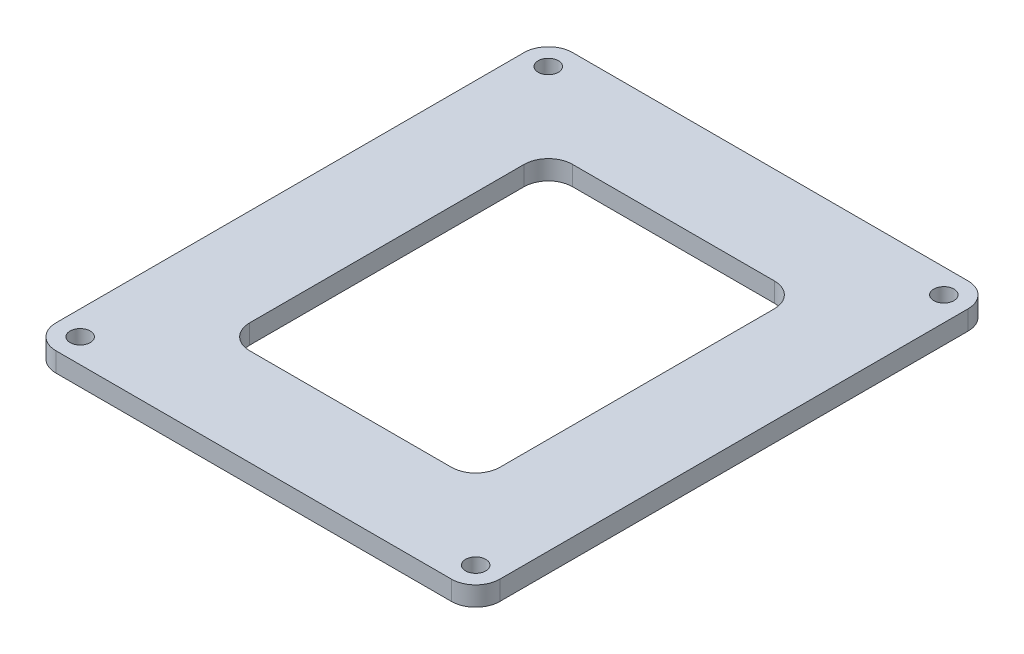
ISO-10303-21;
HEADER;
FILE_DESCRIPTION(('STEP AP214'),'2;1');
FILE_NAME('part.step','',(''),(''),'','','');
FILE_SCHEMA(('AUTOMOTIVE_DESIGN { 1 0 10303 214 1 1 1 1 }'));
ENDSEC;
DATA;
#1=APPLICATION_CONTEXT('core data for automotive mechanical design processes');
#2=APPLICATION_PROTOCOL_DEFINITION('international standard','automotive_design',2000,#1);
#3=PRODUCT_CONTEXT('',#1,'mechanical');
#4=PRODUCT('Part','Part','',(#3));
#5=PRODUCT_RELATED_PRODUCT_CATEGORY('part','',(#4));
#6=PRODUCT_DEFINITION_FORMATION('','',#4);
#7=PRODUCT_DEFINITION_CONTEXT('part definition',#1,'design');
#8=PRODUCT_DEFINITION('design','',#6,#7);
#9=PRODUCT_DEFINITION_SHAPE('','',#8);
#10=(LENGTH_UNIT() NAMED_UNIT(*) SI_UNIT(.MILLI.,.METRE.));
#11=(NAMED_UNIT(*) PLANE_ANGLE_UNIT() SI_UNIT($,.RADIAN.));
#12=(NAMED_UNIT(*) SI_UNIT($,.STERADIAN.) SOLID_ANGLE_UNIT());
#13=UNCERTAINTY_MEASURE_WITH_UNIT(LENGTH_MEASURE(1.E-05),#10,'distance_accuracy_value','');
#14=(GEOMETRIC_REPRESENTATION_CONTEXT(3) GLOBAL_UNCERTAINTY_ASSIGNED_CONTEXT((#13)) GLOBAL_UNIT_ASSIGNED_CONTEXT((#10,
#11,#12)) REPRESENTATION_CONTEXT('',''));
#15=CARTESIAN_POINT('',(0.,0.,0.));
#16=DIRECTION('',(0.,0.,1.));
#17=DIRECTION('',(1.,0.,0.));
#18=AXIS2_PLACEMENT_3D('',#15,#16,#17);
#19=CARTESIAN_POINT('',(0.,2.4,0.));
#20=DIRECTION('',(0.,-1.,0.));
#21=DIRECTION('',(0.,0.,-1.));
#22=AXIS2_PLACEMENT_3D('',#19,#20,#21);
#23=PLANE('',#22);
#24=CARTESIAN_POINT('',(-24.5,2.4,29.));
#25=DIRECTION('',(0.,1.,0.));
#26=DIRECTION('',(0.,0.,-1.));
#27=AXIS2_PLACEMENT_3D('',#24,#25,#26);
#28=CIRCLE('',#27,1.25);
#29=CARTESIAN_POINT('',(-24.5,2.4,27.75));
#30=VERTEX_POINT('',#29);
#31=EDGE_CURVE('E266',#30,#30,#28,.T.);
#32=ORIENTED_EDGE('',*,*,#31,.F.);
#33=EDGE_LOOP('',(#32));
#34=FACE_BOUND('',#33,.T.);
#35=CARTESIAN_POINT('',(24.5,2.4,29.));
#36=DIRECTION('',(0.,1.,0.));
#37=DIRECTION('',(0.,0.,1.));
#38=AXIS2_PLACEMENT_3D('',#35,#36,#37);
#39=CIRCLE('',#38,1.25);
#40=CARTESIAN_POINT('',(24.5,2.4,30.25));
#41=VERTEX_POINT('',#40);
#42=EDGE_CURVE('E274',#41,#41,#39,.T.);
#43=ORIENTED_EDGE('',*,*,#42,.F.);
#44=EDGE_LOOP('',(#43));
#45=FACE_BOUND('',#44,.T.);
#46=CARTESIAN_POINT('',(24.5,2.4,-29.));
#47=DIRECTION('',(0.,1.,0.));
#48=DIRECTION('',(0.,0.,-1.));
#49=AXIS2_PLACEMENT_3D('',#46,#47,#48);
#50=CIRCLE('',#49,1.25);
#51=CARTESIAN_POINT('',(24.5,2.4,-30.25));
#52=VERTEX_POINT('',#51);
#53=EDGE_CURVE('E280',#52,#52,#50,.T.);
#54=ORIENTED_EDGE('',*,*,#53,.F.);
#55=EDGE_LOOP('',(#54));
#56=FACE_BOUND('',#55,.T.);
#57=CARTESIAN_POINT('',(-24.5,2.4,-29.));
#58=DIRECTION('',(0.,1.,0.));
#59=DIRECTION('',(0.,0.,1.));
#60=AXIS2_PLACEMENT_3D('',#57,#58,#59);
#61=CIRCLE('',#60,1.25);
#62=CARTESIAN_POINT('',(-24.5,2.4,-27.75));
#63=VERTEX_POINT('',#62);
#64=EDGE_CURVE('E286',#63,#63,#61,.T.);
#65=ORIENTED_EDGE('',*,*,#64,.F.);
#66=EDGE_LOOP('',(#65));
#67=FACE_BOUND('',#66,.T.);
#68=DIRECTION('',(-1.,0.,0.));
#69=VECTOR('',#68,1.);
#70=CARTESIAN_POINT('',(-27.5,2.4,-32.));
#71=LINE('',#70,#69);
#72=CARTESIAN_POINT('',(24.5,2.4,-32.));
#73=VERTEX_POINT('',#72);
#74=CARTESIAN_POINT('',(-24.5,2.4,-32.));
#75=VERTEX_POINT('',#74);
#76=EDGE_CURVE('E295',#73,#75,#71,.T.);
#77=ORIENTED_EDGE('',*,*,#76,.T.);
#78=CARTESIAN_POINT('',(-24.5,2.4,-29.));
#79=DIRECTION('',(0.,-1.,0.));
#80=DIRECTION('',(0.,0.,-1.));
#81=AXIS2_PLACEMENT_3D('',#78,#79,#80);
#82=CIRCLE('',#81,3.);
#83=CARTESIAN_POINT('',(-27.5,2.4,-29.));
#84=VERTEX_POINT('',#83);
#85=EDGE_CURVE('E217',#75,#84,#82,.F.);
#86=ORIENTED_EDGE('',*,*,#85,.T.);
#87=DIRECTION('',(0.,0.,1.));
#88=VECTOR('',#87,1.);
#89=CARTESIAN_POINT('',(-27.5,2.4,32.));
#90=LINE('',#89,#88);
#91=CARTESIAN_POINT('',(-27.5,2.4,29.));
#92=VERTEX_POINT('',#91);
#93=EDGE_CURVE('E175',#84,#92,#90,.T.);
#94=ORIENTED_EDGE('',*,*,#93,.T.);
#95=CARTESIAN_POINT('',(-24.5,2.4,29.));
#96=DIRECTION('',(0.,-1.,0.));
#97=DIRECTION('',(0.,0.,-1.));
#98=AXIS2_PLACEMENT_3D('',#95,#96,#97);
#99=CIRCLE('',#98,3.);
#100=CARTESIAN_POINT('',(-24.5,2.4,32.));
#101=VERTEX_POINT('',#100);
#102=EDGE_CURVE('E57',#92,#101,#99,.F.);
#103=ORIENTED_EDGE('',*,*,#102,.T.);
#104=DIRECTION('',(1.,0.,0.));
#105=VECTOR('',#104,1.);
#106=CARTESIAN_POINT('',(-27.5,2.4,32.));
#107=LINE('',#106,#105);
#108=CARTESIAN_POINT('',(24.5,2.4,32.));
#109=VERTEX_POINT('',#108);
#110=EDGE_CURVE('E171',#101,#109,#107,.T.);
#111=ORIENTED_EDGE('',*,*,#110,.T.);
#112=CARTESIAN_POINT('',(24.5,2.4,29.));
#113=DIRECTION('',(0.,-1.,0.));
#114=DIRECTION('',(0.,0.,-1.));
#115=AXIS2_PLACEMENT_3D('',#112,#113,#114);
#116=CIRCLE('',#115,3.);
#117=CARTESIAN_POINT('',(27.5,2.4,29.));
#118=VERTEX_POINT('',#117);
#119=EDGE_CURVE('E213',#109,#118,#116,.F.);
#120=ORIENTED_EDGE('',*,*,#119,.T.);
#121=DIRECTION('',(0.,0.,-1.));
#122=VECTOR('',#121,1.);
#123=CARTESIAN_POINT('',(27.5,2.4,32.));
#124=LINE('',#123,#122);
#125=CARTESIAN_POINT('',(27.5,2.4,-29.));
#126=VERTEX_POINT('',#125);
#127=EDGE_CURVE('E292',#118,#126,#124,.T.);
#128=ORIENTED_EDGE('',*,*,#127,.T.);
#129=CARTESIAN_POINT('',(24.5,2.4,-29.));
#130=DIRECTION('',(0.,-1.,0.));
#131=DIRECTION('',(0.,0.,-1.));
#132=AXIS2_PLACEMENT_3D('',#129,#130,#131);
#133=CIRCLE('',#132,3.);
#134=EDGE_CURVE('E215',#126,#73,#133,.F.);
#135=ORIENTED_EDGE('',*,*,#134,.T.);
#136=EDGE_LOOP('',(#77,#86,#94,#103,#111,#120,#128,#135));
#137=FACE_BOUND('',#136,.T.);
#138=DIRECTION('',(1.,0.,0.));
#139=VECTOR('',#138,1.);
#140=CARTESIAN_POINT('',(-15.5,2.4,20.));
#141=LINE('',#140,#139);
#142=CARTESIAN_POINT('',(-12.5,2.4,20.));
#143=VERTEX_POINT('',#142);
#144=CARTESIAN_POINT('',(12.5,2.4,20.));
#145=VERTEX_POINT('',#144);
#146=EDGE_CURVE('E167',#143,#145,#141,.T.);
#147=ORIENTED_EDGE('',*,*,#146,.F.);
#148=CARTESIAN_POINT('',(-12.5,2.4,17.));
#149=DIRECTION('',(0.,-1.,0.));
#150=DIRECTION('',(0.,0.,-1.));
#151=AXIS2_PLACEMENT_3D('',#148,#149,#150);
#152=CIRCLE('',#151,3.);
#153=CARTESIAN_POINT('',(-15.5,2.4,17.));
#154=VERTEX_POINT('',#153);
#155=EDGE_CURVE('E230',#143,#154,#152,.T.);
#156=ORIENTED_EDGE('',*,*,#155,.T.);
#157=DIRECTION('',(0.,0.,1.));
#158=VECTOR('',#157,1.);
#159=CARTESIAN_POINT('',(-15.5,2.4,20.));
#160=LINE('',#159,#158);
#161=CARTESIAN_POINT('',(-15.5,2.4,-17.));
#162=VERTEX_POINT('',#161);
#163=EDGE_CURVE('E273',#162,#154,#160,.T.);
#164=ORIENTED_EDGE('',*,*,#163,.F.);
#165=CARTESIAN_POINT('',(-12.5,2.4,-17.));
#166=DIRECTION('',(0.,-1.,0.));
#167=DIRECTION('',(0.,0.,-1.));
#168=AXIS2_PLACEMENT_3D('',#165,#166,#167);
#169=CIRCLE('',#168,3.);
#170=CARTESIAN_POINT('',(-12.5,2.4,-20.));
#171=VERTEX_POINT('',#170);
#172=EDGE_CURVE('E11',#162,#171,#169,.T.);
#173=ORIENTED_EDGE('',*,*,#172,.T.);
#174=DIRECTION('',(-1.,0.,0.));
#175=VECTOR('',#174,1.);
#176=CARTESIAN_POINT('',(-15.5,2.4,-20.));
#177=LINE('',#176,#175);
#178=CARTESIAN_POINT('',(12.5,2.4,-20.));
#179=VERTEX_POINT('',#178);
#180=EDGE_CURVE('E247',#179,#171,#177,.T.);
#181=ORIENTED_EDGE('',*,*,#180,.F.);
#182=CARTESIAN_POINT('',(12.5,2.4,-17.));
#183=DIRECTION('',(0.,-1.,0.));
#184=DIRECTION('',(0.,0.,-1.));
#185=AXIS2_PLACEMENT_3D('',#182,#183,#184);
#186=CIRCLE('',#185,3.);
#187=CARTESIAN_POINT('',(15.5,2.4,-17.));
#188=VERTEX_POINT('',#187);
#189=EDGE_CURVE('E158',#179,#188,#186,.T.);
#190=ORIENTED_EDGE('',*,*,#189,.T.);
#191=DIRECTION('',(0.,0.,-1.));
#192=VECTOR('',#191,1.);
#193=CARTESIAN_POINT('',(15.5,2.4,20.));
#194=LINE('',#193,#192);
#195=CARTESIAN_POINT('',(15.5,2.4,17.));
#196=VERTEX_POINT('',#195);
#197=EDGE_CURVE('E244',#196,#188,#194,.T.);
#198=ORIENTED_EDGE('',*,*,#197,.F.);
#199=CARTESIAN_POINT('',(12.5,2.4,17.));
#200=DIRECTION('',(0.,-1.,0.));
#201=DIRECTION('',(0.,0.,-1.));
#202=AXIS2_PLACEMENT_3D('',#199,#200,#201);
#203=CIRCLE('',#202,3.);
#204=EDGE_CURVE('E234',#196,#145,#203,.T.);
#205=ORIENTED_EDGE('',*,*,#204,.T.);
#206=EDGE_LOOP('',(#147,#156,#164,#173,#181,#190,#198,#205));
#207=FACE_BOUND('',#206,.T.);
#208=ADVANCED_FACE('F35',(#34,#45,#56,#67,#137,#207),#23,.F.);
#209=CARTESIAN_POINT('',(0.,0.,0.));
#210=DIRECTION('',(0.,-1.,0.));
#211=DIRECTION('',(0.,0.,-1.));
#212=AXIS2_PLACEMENT_3D('',#209,#210,#211);
#213=PLANE('',#212);
#214=CARTESIAN_POINT('',(24.5,0.,29.));
#215=DIRECTION('',(0.,1.,0.));
#216=DIRECTION('',(0.,0.,1.));
#217=AXIS2_PLACEMENT_3D('',#214,#215,#216);
#218=CIRCLE('',#217,1.25);
#219=CARTESIAN_POINT('',(24.5,0.,30.25));
#220=VERTEX_POINT('',#219);
#221=EDGE_CURVE('E269',#220,#220,#218,.T.);
#222=ORIENTED_EDGE('',*,*,#221,.T.);
#223=EDGE_LOOP('',(#222));
#224=FACE_BOUND('',#223,.T.);
#225=CARTESIAN_POINT('',(-24.5,0.,-29.));
#226=DIRECTION('',(0.,1.,0.));
#227=DIRECTION('',(0.,0.,1.));
#228=AXIS2_PLACEMENT_3D('',#225,#226,#227);
#229=CIRCLE('',#228,1.25);
#230=CARTESIAN_POINT('',(-24.5,0.,-27.75));
#231=VERTEX_POINT('',#230);
#232=EDGE_CURVE('E283',#231,#231,#229,.T.);
#233=ORIENTED_EDGE('',*,*,#232,.T.);
#234=EDGE_LOOP('',(#233));
#235=FACE_BOUND('',#234,.T.);
#236=DIRECTION('',(0.,0.,1.));
#237=VECTOR('',#236,1.);
#238=CARTESIAN_POINT('',(-27.5,0.,32.));
#239=LINE('',#238,#237);
#240=CARTESIAN_POINT('',(-27.5,0.,-29.));
#241=VERTEX_POINT('',#240);
#242=CARTESIAN_POINT('',(-27.5,0.,29.));
#243=VERTEX_POINT('',#242);
#244=EDGE_CURVE('E303',#241,#243,#239,.T.);
#245=ORIENTED_EDGE('',*,*,#244,.F.);
#246=CARTESIAN_POINT('',(-24.5,0.,-29.));
#247=DIRECTION('',(0.,-1.,0.));
#248=DIRECTION('',(0.,0.,-1.));
#249=AXIS2_PLACEMENT_3D('',#246,#247,#248);
#250=CIRCLE('',#249,3.);
#251=CARTESIAN_POINT('',(-24.5,0.,-32.));
#252=VERTEX_POINT('',#251);
#253=EDGE_CURVE('E205',#241,#252,#250,.T.);
#254=ORIENTED_EDGE('',*,*,#253,.T.);
#255=DIRECTION('',(-1.,0.,0.));
#256=VECTOR('',#255,1.);
#257=CARTESIAN_POINT('',(-27.5,0.,-32.));
#258=LINE('',#257,#256);
#259=CARTESIAN_POINT('',(24.5,0.,-32.));
#260=VERTEX_POINT('',#259);
#261=EDGE_CURVE('E301',#260,#252,#258,.T.);
#262=ORIENTED_EDGE('',*,*,#261,.F.);
#263=CARTESIAN_POINT('',(24.5,0.,-29.));
#264=DIRECTION('',(0.,-1.,0.));
#265=DIRECTION('',(0.,0.,-1.));
#266=AXIS2_PLACEMENT_3D('',#263,#264,#265);
#267=CIRCLE('',#266,3.);
#268=CARTESIAN_POINT('',(27.5,0.,-29.));
#269=VERTEX_POINT('',#268);
#270=EDGE_CURVE('E203',#260,#269,#267,.T.);
#271=ORIENTED_EDGE('',*,*,#270,.T.);
#272=DIRECTION('',(0.,0.,-1.));
#273=VECTOR('',#272,1.);
#274=CARTESIAN_POINT('',(27.5,0.,32.));
#275=LINE('',#274,#273);
#276=CARTESIAN_POINT('',(27.5,0.,29.));
#277=VERTEX_POINT('',#276);
#278=EDGE_CURVE('E289',#277,#269,#275,.T.);
#279=ORIENTED_EDGE('',*,*,#278,.F.);
#280=CARTESIAN_POINT('',(24.5,0.,29.));
#281=DIRECTION('',(0.,-1.,0.));
#282=DIRECTION('',(0.,0.,-1.));
#283=AXIS2_PLACEMENT_3D('',#280,#281,#282);
#284=CIRCLE('',#283,3.);
#285=CARTESIAN_POINT('',(24.5,0.,32.));
#286=VERTEX_POINT('',#285);
#287=EDGE_CURVE('E201',#277,#286,#284,.T.);
#288=ORIENTED_EDGE('',*,*,#287,.T.);
#289=DIRECTION('',(1.,0.,0.));
#290=VECTOR('',#289,1.);
#291=CARTESIAN_POINT('',(-27.5,0.,32.));
#292=LINE('',#291,#290);
#293=CARTESIAN_POINT('',(-24.5,0.,32.));
#294=VERTEX_POINT('',#293);
#295=EDGE_CURVE('E178',#294,#286,#292,.T.);
#296=ORIENTED_EDGE('',*,*,#295,.F.);
#297=CARTESIAN_POINT('',(-24.5,0.,29.));
#298=DIRECTION('',(0.,-1.,0.));
#299=DIRECTION('',(0.,0.,-1.));
#300=AXIS2_PLACEMENT_3D('',#297,#298,#299);
#301=CIRCLE('',#300,3.);
#302=EDGE_CURVE('E199',#294,#243,#301,.T.);
#303=ORIENTED_EDGE('',*,*,#302,.T.);
#304=EDGE_LOOP('',(#245,#254,#262,#271,#279,#288,#296,#303));
#305=FACE_BOUND('',#304,.T.);
#306=CARTESIAN_POINT('',(24.5,0.,-29.));
#307=DIRECTION('',(0.,1.,0.));
#308=DIRECTION('',(0.,0.,-1.));
#309=AXIS2_PLACEMENT_3D('',#306,#307,#308);
#310=CIRCLE('',#309,1.25);
#311=CARTESIAN_POINT('',(24.5,0.,-30.25));
#312=VERTEX_POINT('',#311);
#313=EDGE_CURVE('E277',#312,#312,#310,.T.);
#314=ORIENTED_EDGE('',*,*,#313,.T.);
#315=EDGE_LOOP('',(#314));
#316=FACE_BOUND('',#315,.T.);
#317=CARTESIAN_POINT('',(-24.5,0.,29.));
#318=DIRECTION('',(0.,1.,0.));
#319=DIRECTION('',(0.,0.,-1.));
#320=AXIS2_PLACEMENT_3D('',#317,#318,#319);
#321=CIRCLE('',#320,1.25);
#322=CARTESIAN_POINT('',(-24.5,0.,27.75));
#323=VERTEX_POINT('',#322);
#324=EDGE_CURVE('E270',#323,#323,#321,.T.);
#325=ORIENTED_EDGE('',*,*,#324,.T.);
#326=EDGE_LOOP('',(#325));
#327=FACE_BOUND('',#326,.T.);
#328=DIRECTION('',(-1.,0.,0.));
#329=VECTOR('',#328,1.);
#330=CARTESIAN_POINT('',(-15.5,0.,-20.));
#331=LINE('',#330,#329);
#332=CARTESIAN_POINT('',(12.5,0.,-20.));
#333=VERTEX_POINT('',#332);
#334=CARTESIAN_POINT('',(-12.5,0.,-20.));
#335=VERTEX_POINT('',#334);
#336=EDGE_CURVE('E153',#333,#335,#331,.T.);
#337=ORIENTED_EDGE('',*,*,#336,.T.);
#338=CARTESIAN_POINT('',(-12.5,0.,-17.));
#339=DIRECTION('',(0.,-1.,0.));
#340=DIRECTION('',(0.,0.,-1.));
#341=AXIS2_PLACEMENT_3D('',#338,#339,#340);
#342=CIRCLE('',#341,3.);
#343=CARTESIAN_POINT('',(-15.5,0.,-17.));
#344=VERTEX_POINT('',#343);
#345=EDGE_CURVE('E43',#335,#344,#342,.F.);
#346=ORIENTED_EDGE('',*,*,#345,.T.);
#347=DIRECTION('',(0.,0.,1.));
#348=VECTOR('',#347,1.);
#349=CARTESIAN_POINT('',(-15.5,0.,20.));
#350=LINE('',#349,#348);
#351=CARTESIAN_POINT('',(-15.5,0.,17.));
#352=VERTEX_POINT('',#351);
#353=EDGE_CURVE('E151',#344,#352,#350,.T.);
#354=ORIENTED_EDGE('',*,*,#353,.T.);
#355=CARTESIAN_POINT('',(-12.5,0.,17.));
#356=DIRECTION('',(0.,-1.,0.));
#357=DIRECTION('',(0.,0.,-1.));
#358=AXIS2_PLACEMENT_3D('',#355,#356,#357);
#359=CIRCLE('',#358,3.);
#360=CARTESIAN_POINT('',(-12.5,0.,20.));
#361=VERTEX_POINT('',#360);
#362=EDGE_CURVE('E228',#352,#361,#359,.F.);
#363=ORIENTED_EDGE('',*,*,#362,.T.);
#364=DIRECTION('',(1.,0.,0.));
#365=VECTOR('',#364,1.);
#366=CARTESIAN_POINT('',(-15.5,0.,20.));
#367=LINE('',#366,#365);
#368=CARTESIAN_POINT('',(12.5,0.,20.));
#369=VERTEX_POINT('',#368);
#370=EDGE_CURVE('E262',#361,#369,#367,.T.);
#371=ORIENTED_EDGE('',*,*,#370,.T.);
#372=CARTESIAN_POINT('',(12.5,0.,17.));
#373=DIRECTION('',(0.,-1.,0.));
#374=DIRECTION('',(0.,0.,-1.));
#375=AXIS2_PLACEMENT_3D('',#372,#373,#374);
#376=CIRCLE('',#375,3.);
#377=CARTESIAN_POINT('',(15.5,0.,17.));
#378=VERTEX_POINT('',#377);
#379=EDGE_CURVE('E232',#369,#378,#376,.F.);
#380=ORIENTED_EDGE('',*,*,#379,.T.);
#381=DIRECTION('',(0.,0.,-1.));
#382=VECTOR('',#381,1.);
#383=CARTESIAN_POINT('',(15.5,0.,20.));
#384=LINE('',#383,#382);
#385=CARTESIAN_POINT('',(15.5,0.,-17.));
#386=VERTEX_POINT('',#385);
#387=EDGE_CURVE('E258',#378,#386,#384,.T.);
#388=ORIENTED_EDGE('',*,*,#387,.T.);
#389=CARTESIAN_POINT('',(12.5,0.,-17.));
#390=DIRECTION('',(0.,-1.,0.));
#391=DIRECTION('',(0.,0.,-1.));
#392=AXIS2_PLACEMENT_3D('',#389,#390,#391);
#393=CIRCLE('',#392,3.);
#394=EDGE_CURVE('E236',#386,#333,#393,.F.);
#395=ORIENTED_EDGE('',*,*,#394,.T.);
#396=EDGE_LOOP('',(#337,#346,#354,#363,#371,#380,#388,#395));
#397=FACE_BOUND('',#396,.T.);
#398=ADVANCED_FACE('F150',(#224,#235,#305,#316,#327,#397),#213,.T.);
#399=CARTESIAN_POINT('',(27.5,2.4,32.));
#400=DIRECTION('',(-1.,0.,0.));
#401=DIRECTION('',(0.,0.,1.));
#402=AXIS2_PLACEMENT_3D('',#399,#400,#401);
#403=PLANE('',#402);
#404=ORIENTED_EDGE('',*,*,#278,.T.);
#405=DIRECTION('',(0.,-1.,0.));
#406=VECTOR('',#405,1.);
#407=CARTESIAN_POINT('',(27.5,2.4,-29.));
#408=LINE('',#407,#406);
#409=EDGE_CURVE('E222',#269,#126,#408,.F.);
#410=ORIENTED_EDGE('',*,*,#409,.T.);
#411=ORIENTED_EDGE('',*,*,#127,.F.);
#412=DIRECTION('',(0.,-1.,0.));
#413=VECTOR('',#412,1.);
#414=CARTESIAN_POINT('',(27.5,2.4,29.));
#415=LINE('',#414,#413);
#416=EDGE_CURVE('E219',#118,#277,#415,.T.);
#417=ORIENTED_EDGE('',*,*,#416,.T.);
#418=EDGE_LOOP('',(#404,#410,#411,#417));
#419=FACE_BOUND('',#418,.T.);
#420=ADVANCED_FACE('F319',(#419),#403,.F.);
#421=CARTESIAN_POINT('',(-27.5,2.4,-32.));
#422=DIRECTION('',(0.,0.,1.));
#423=DIRECTION('',(1.,0.,0.));
#424=AXIS2_PLACEMENT_3D('',#421,#422,#423);
#425=PLANE('',#424);
#426=ORIENTED_EDGE('',*,*,#261,.T.);
#427=DIRECTION('',(0.,-1.,0.));
#428=VECTOR('',#427,1.);
#429=CARTESIAN_POINT('',(-24.5,2.4,-32.));
#430=LINE('',#429,#428);
#431=EDGE_CURVE('E210',#252,#75,#430,.F.);
#432=ORIENTED_EDGE('',*,*,#431,.T.);
#433=ORIENTED_EDGE('',*,*,#76,.F.);
#434=DIRECTION('',(0.,-1.,0.));
#435=VECTOR('',#434,1.);
#436=CARTESIAN_POINT('',(24.5,2.4,-32.));
#437=LINE('',#436,#435);
#438=EDGE_CURVE('E207',#73,#260,#437,.T.);
#439=ORIENTED_EDGE('',*,*,#438,.T.);
#440=EDGE_LOOP('',(#426,#432,#433,#439));
#441=FACE_BOUND('',#440,.T.);
#442=ADVANCED_FACE('F328',(#441),#425,.F.);
#443=CARTESIAN_POINT('',(-27.5,2.4,32.));
#444=DIRECTION('',(1.,0.,0.));
#445=DIRECTION('',(0.,0.,-1.));
#446=AXIS2_PLACEMENT_3D('',#443,#444,#445);
#447=PLANE('',#446);
#448=ORIENTED_EDGE('',*,*,#93,.F.);
#449=DIRECTION('',(0.,-1.,0.));
#450=VECTOR('',#449,1.);
#451=CARTESIAN_POINT('',(-27.5,2.4,-29.));
#452=LINE('',#451,#450);
#453=EDGE_CURVE('E196',#84,#241,#452,.T.);
#454=ORIENTED_EDGE('',*,*,#453,.T.);
#455=ORIENTED_EDGE('',*,*,#244,.T.);
#456=DIRECTION('',(0.,-1.,0.));
#457=VECTOR('',#456,1.);
#458=CARTESIAN_POINT('',(-27.5,2.4,29.));
#459=LINE('',#458,#457);
#460=EDGE_CURVE('E194',#243,#92,#459,.F.);
#461=ORIENTED_EDGE('',*,*,#460,.T.);
#462=EDGE_LOOP('',(#448,#454,#455,#461));
#463=FACE_BOUND('',#462,.T.);
#464=ADVANCED_FACE('F335',(#463),#447,.F.);
#465=CARTESIAN_POINT('',(-27.5,2.4,32.));
#466=DIRECTION('',(0.,0.,-1.));
#467=DIRECTION('',(-1.,0.,0.));
#468=AXIS2_PLACEMENT_3D('',#465,#466,#467);
#469=PLANE('',#468);
#470=ORIENTED_EDGE('',*,*,#295,.T.);
#471=DIRECTION('',(0.,-1.,0.));
#472=VECTOR('',#471,1.);
#473=CARTESIAN_POINT('',(24.5,2.4,32.));
#474=LINE('',#473,#472);
#475=EDGE_CURVE('E50',#286,#109,#474,.F.);
#476=ORIENTED_EDGE('',*,*,#475,.T.);
#477=ORIENTED_EDGE('',*,*,#110,.F.);
#478=DIRECTION('',(0.,-1.,0.));
#479=VECTOR('',#478,1.);
#480=CARTESIAN_POINT('',(-24.5,2.4,32.));
#481=LINE('',#480,#479);
#482=EDGE_CURVE('E224',#101,#294,#481,.T.);
#483=ORIENTED_EDGE('',*,*,#482,.T.);
#484=EDGE_LOOP('',(#470,#476,#477,#483));
#485=FACE_BOUND('',#484,.T.);
#486=ADVANCED_FACE('F309',(#485),#469,.F.);
#487=CARTESIAN_POINT('',(-24.5,2.4,-29.));
#488=DIRECTION('',(0.,-1.,0.));
#489=DIRECTION('',(0.,0.,-1.));
#490=AXIS2_PLACEMENT_3D('',#487,#488,#489);
#491=CYLINDRICAL_SURFACE('',#490,1.25);
#492=ORIENTED_EDGE('',*,*,#64,.T.);
#493=EDGE_LOOP('',(#492));
#494=FACE_BOUND('',#493,.T.);
#495=ORIENTED_EDGE('',*,*,#232,.F.);
#496=EDGE_LOOP('',(#495));
#497=FACE_BOUND('',#496,.T.);
#498=ADVANCED_FACE('F368',(#494,#497),#491,.F.);
#499=CARTESIAN_POINT('',(24.5,2.4,-29.));
#500=DIRECTION('',(0.,-1.,0.));
#501=DIRECTION('',(0.,0.,-1.));
#502=AXIS2_PLACEMENT_3D('',#499,#500,#501);
#503=CYLINDRICAL_SURFACE('',#502,1.25);
#504=ORIENTED_EDGE('',*,*,#53,.T.);
#505=EDGE_LOOP('',(#504));
#506=FACE_BOUND('',#505,.T.);
#507=ORIENTED_EDGE('',*,*,#313,.F.);
#508=EDGE_LOOP('',(#507));
#509=FACE_BOUND('',#508,.T.);
#510=ADVANCED_FACE('F357',(#506,#509),#503,.F.);
#511=CARTESIAN_POINT('',(24.5,2.4,29.));
#512=DIRECTION('',(0.,-1.,0.));
#513=DIRECTION('',(0.,0.,-1.));
#514=AXIS2_PLACEMENT_3D('',#511,#512,#513);
#515=CYLINDRICAL_SURFACE('',#514,1.25);
#516=ORIENTED_EDGE('',*,*,#42,.T.);
#517=EDGE_LOOP('',(#516));
#518=FACE_BOUND('',#517,.T.);
#519=ORIENTED_EDGE('',*,*,#221,.F.);
#520=EDGE_LOOP('',(#519));
#521=FACE_BOUND('',#520,.T.);
#522=ADVANCED_FACE('F348',(#518,#521),#515,.F.);
#523=CARTESIAN_POINT('',(-24.5,2.4,29.));
#524=DIRECTION('',(0.,-1.,0.));
#525=DIRECTION('',(0.,0.,-1.));
#526=AXIS2_PLACEMENT_3D('',#523,#524,#525);
#527=CYLINDRICAL_SURFACE('',#526,1.25);
#528=ORIENTED_EDGE('',*,*,#31,.T.);
#529=EDGE_LOOP('',(#528));
#530=FACE_BOUND('',#529,.T.);
#531=ORIENTED_EDGE('',*,*,#324,.F.);
#532=EDGE_LOOP('',(#531));
#533=FACE_BOUND('',#532,.T.);
#534=ADVANCED_FACE('F345',(#530,#533),#527,.F.);
#535=CARTESIAN_POINT('',(-15.5,2.4,20.));
#536=DIRECTION('',(0.,0.,-1.));
#537=DIRECTION('',(-1.,0.,0.));
#538=AXIS2_PLACEMENT_3D('',#535,#536,#537);
#539=PLANE('',#538);
#540=ORIENTED_EDGE('',*,*,#370,.F.);
#541=DIRECTION('',(0.,-1.,0.));
#542=VECTOR('',#541,1.);
#543=CARTESIAN_POINT('',(-12.5,2.4,20.));
#544=LINE('',#543,#542);
#545=EDGE_CURVE('E183',#361,#143,#544,.F.);
#546=ORIENTED_EDGE('',*,*,#545,.T.);
#547=ORIENTED_EDGE('',*,*,#146,.T.);
#548=DIRECTION('',(0.,-1.,0.));
#549=VECTOR('',#548,1.);
#550=CARTESIAN_POINT('',(12.5,0.,20.));
#551=LINE('',#550,#549);
#552=EDGE_CURVE('E173',#145,#369,#551,.T.);
#553=ORIENTED_EDGE('',*,*,#552,.T.);
#554=EDGE_LOOP('',(#540,#546,#547,#553));
#555=FACE_BOUND('',#554,.T.);
#556=ADVANCED_FACE('F347',(#555),#539,.T.);
#557=CARTESIAN_POINT('',(15.5,2.4,20.));
#558=DIRECTION('',(-1.,0.,0.));
#559=DIRECTION('',(0.,0.,1.));
#560=AXIS2_PLACEMENT_3D('',#557,#558,#559);
#561=PLANE('',#560);
#562=ORIENTED_EDGE('',*,*,#387,.F.);
#563=DIRECTION('',(0.,-1.,0.));
#564=VECTOR('',#563,1.);
#565=CARTESIAN_POINT('',(15.5,2.4,17.));
#566=LINE('',#565,#564);
#567=EDGE_CURVE('E188',#378,#196,#566,.F.);
#568=ORIENTED_EDGE('',*,*,#567,.T.);
#569=ORIENTED_EDGE('',*,*,#197,.T.);
#570=DIRECTION('',(0.,-1.,0.));
#571=VECTOR('',#570,1.);
#572=CARTESIAN_POINT('',(15.5,0.,-17.));
#573=LINE('',#572,#571);
#574=EDGE_CURVE('E185',#188,#386,#573,.T.);
#575=ORIENTED_EDGE('',*,*,#574,.T.);
#576=EDGE_LOOP('',(#562,#568,#569,#575));
#577=FACE_BOUND('',#576,.T.);
#578=ADVANCED_FACE('F253',(#577),#561,.T.);
#579=CARTESIAN_POINT('',(-15.5,2.4,-20.));
#580=DIRECTION('',(0.,0.,1.));
#581=DIRECTION('',(1.,0.,0.));
#582=AXIS2_PLACEMENT_3D('',#579,#580,#581);
#583=PLANE('',#582);
#584=ORIENTED_EDGE('',*,*,#336,.F.);
#585=DIRECTION('',(0.,-1.,0.));
#586=VECTOR('',#585,1.);
#587=CARTESIAN_POINT('',(12.5,2.4,-20.));
#588=LINE('',#587,#586);
#589=EDGE_CURVE('E192',#333,#179,#588,.F.);
#590=ORIENTED_EDGE('',*,*,#589,.T.);
#591=ORIENTED_EDGE('',*,*,#180,.T.);
#592=DIRECTION('',(0.,-1.,0.));
#593=VECTOR('',#592,1.);
#594=CARTESIAN_POINT('',(-12.5,0.,-20.));
#595=LINE('',#594,#593);
#596=EDGE_CURVE('E190',#171,#335,#595,.T.);
#597=ORIENTED_EDGE('',*,*,#596,.T.);
#598=EDGE_LOOP('',(#584,#590,#591,#597));
#599=FACE_BOUND('',#598,.T.);
#600=ADVANCED_FACE('F260',(#599),#583,.T.);
#601=CARTESIAN_POINT('',(-15.5,2.4,20.));
#602=DIRECTION('',(1.,0.,0.));
#603=DIRECTION('',(0.,0.,-1.));
#604=AXIS2_PLACEMENT_3D('',#601,#602,#603);
#605=PLANE('',#604);
#606=ORIENTED_EDGE('',*,*,#163,.T.);
#607=DIRECTION('',(0.,-1.,0.));
#608=VECTOR('',#607,1.);
#609=CARTESIAN_POINT('',(-15.5,0.,17.));
#610=LINE('',#609,#608);
#611=EDGE_CURVE('E166',#154,#352,#610,.T.);
#612=ORIENTED_EDGE('',*,*,#611,.T.);
#613=ORIENTED_EDGE('',*,*,#353,.F.);
#614=DIRECTION('',(0.,-1.,0.));
#615=VECTOR('',#614,1.);
#616=CARTESIAN_POINT('',(-15.5,2.4,-17.));
#617=LINE('',#616,#615);
#618=EDGE_CURVE('E163',#344,#162,#617,.F.);
#619=ORIENTED_EDGE('',*,*,#618,.T.);
#620=EDGE_LOOP('',(#606,#612,#613,#619));
#621=FACE_BOUND('',#620,.T.);
#622=ADVANCED_FACE('F162',(#621),#605,.T.);
#623=CARTESIAN_POINT('',(-12.5,2.4,17.));
#624=DIRECTION('',(0.,1.,0.));
#625=DIRECTION('',(0.,0.,1.));
#626=AXIS2_PLACEMENT_3D('',#623,#624,#625);
#627=CYLINDRICAL_SURFACE('',#626,3.);
#628=ORIENTED_EDGE('',*,*,#155,.F.);
#629=ORIENTED_EDGE('',*,*,#545,.F.);
#630=ORIENTED_EDGE('',*,*,#362,.F.);
#631=ORIENTED_EDGE('',*,*,#611,.F.);
#632=EDGE_LOOP('',(#628,#629,#630,#631));
#633=FACE_BOUND('',#632,.T.);
#634=ADVANCED_FACE('F379',(#633),#627,.F.);
#635=CARTESIAN_POINT('',(12.5,2.4,17.));
#636=DIRECTION('',(0.,1.,0.));
#637=DIRECTION('',(0.,0.,1.));
#638=AXIS2_PLACEMENT_3D('',#635,#636,#637);
#639=CYLINDRICAL_SURFACE('',#638,3.);
#640=ORIENTED_EDGE('',*,*,#204,.F.);
#641=ORIENTED_EDGE('',*,*,#567,.F.);
#642=ORIENTED_EDGE('',*,*,#379,.F.);
#643=ORIENTED_EDGE('',*,*,#552,.F.);
#644=EDGE_LOOP('',(#640,#641,#642,#643));
#645=FACE_BOUND('',#644,.T.);
#646=ADVANCED_FACE('F382',(#645),#639,.F.);
#647=CARTESIAN_POINT('',(12.5,2.4,-17.));
#648=DIRECTION('',(0.,1.,0.));
#649=DIRECTION('',(0.,0.,1.));
#650=AXIS2_PLACEMENT_3D('',#647,#648,#649);
#651=CYLINDRICAL_SURFACE('',#650,3.);
#652=ORIENTED_EDGE('',*,*,#189,.F.);
#653=ORIENTED_EDGE('',*,*,#589,.F.);
#654=ORIENTED_EDGE('',*,*,#394,.F.);
#655=ORIENTED_EDGE('',*,*,#574,.F.);
#656=EDGE_LOOP('',(#652,#653,#654,#655));
#657=FACE_BOUND('',#656,.T.);
#658=ADVANCED_FACE('F257',(#657),#651,.F.);
#659=CARTESIAN_POINT('',(-12.5,2.4,-17.));
#660=DIRECTION('',(0.,1.,0.));
#661=DIRECTION('',(0.,0.,1.));
#662=AXIS2_PLACEMENT_3D('',#659,#660,#661);
#663=CYLINDRICAL_SURFACE('',#662,3.);
#664=ORIENTED_EDGE('',*,*,#172,.F.);
#665=ORIENTED_EDGE('',*,*,#618,.F.);
#666=ORIENTED_EDGE('',*,*,#345,.F.);
#667=ORIENTED_EDGE('',*,*,#596,.F.);
#668=EDGE_LOOP('',(#664,#665,#666,#667));
#669=FACE_BOUND('',#668,.T.);
#670=ADVANCED_FACE('F170',(#669),#663,.F.);
#671=CARTESIAN_POINT('',(-24.5,2.4,-29.));
#672=DIRECTION('',(0.,-1.,0.));
#673=DIRECTION('',(0.,0.,-1.));
#674=AXIS2_PLACEMENT_3D('',#671,#672,#673);
#675=CYLINDRICAL_SURFACE('',#674,3.);
#676=ORIENTED_EDGE('',*,*,#85,.F.);
#677=ORIENTED_EDGE('',*,*,#431,.F.);
#678=ORIENTED_EDGE('',*,*,#253,.F.);
#679=ORIENTED_EDGE('',*,*,#453,.F.);
#680=EDGE_LOOP('',(#676,#677,#678,#679));
#681=FACE_BOUND('',#680,.T.);
#682=ADVANCED_FACE('F332',(#681),#675,.T.);
#683=CARTESIAN_POINT('',(24.5,2.4,-29.));
#684=DIRECTION('',(0.,-1.,0.));
#685=DIRECTION('',(0.,0.,-1.));
#686=AXIS2_PLACEMENT_3D('',#683,#684,#685);
#687=CYLINDRICAL_SURFACE('',#686,3.);
#688=ORIENTED_EDGE('',*,*,#134,.F.);
#689=ORIENTED_EDGE('',*,*,#409,.F.);
#690=ORIENTED_EDGE('',*,*,#270,.F.);
#691=ORIENTED_EDGE('',*,*,#438,.F.);
#692=EDGE_LOOP('',(#688,#689,#690,#691));
#693=FACE_BOUND('',#692,.T.);
#694=ADVANCED_FACE('F323',(#693),#687,.T.);
#695=CARTESIAN_POINT('',(24.5,2.4,29.));
#696=DIRECTION('',(0.,-1.,0.));
#697=DIRECTION('',(0.,0.,-1.));
#698=AXIS2_PLACEMENT_3D('',#695,#696,#697);
#699=CYLINDRICAL_SURFACE('',#698,3.);
#700=ORIENTED_EDGE('',*,*,#119,.F.);
#701=ORIENTED_EDGE('',*,*,#475,.F.);
#702=ORIENTED_EDGE('',*,*,#287,.F.);
#703=ORIENTED_EDGE('',*,*,#416,.F.);
#704=EDGE_LOOP('',(#700,#701,#702,#703));
#705=FACE_BOUND('',#704,.T.);
#706=ADVANCED_FACE('F314',(#705),#699,.T.);
#707=CARTESIAN_POINT('',(-24.5,2.4,29.));
#708=DIRECTION('',(0.,-1.,0.));
#709=DIRECTION('',(0.,0.,-1.));
#710=AXIS2_PLACEMENT_3D('',#707,#708,#709);
#711=CYLINDRICAL_SURFACE('',#710,3.);
#712=ORIENTED_EDGE('',*,*,#102,.F.);
#713=ORIENTED_EDGE('',*,*,#460,.F.);
#714=ORIENTED_EDGE('',*,*,#302,.F.);
#715=ORIENTED_EDGE('',*,*,#482,.F.);
#716=EDGE_LOOP('',(#712,#713,#714,#715));
#717=FACE_BOUND('',#716,.T.);
#718=ADVANCED_FACE('F37',(#717),#711,.T.);
#719=CLOSED_SHELL('',(#208,#398,#420,#442,#464,#486,#498,#510,#522,#534,#556,#578,#600,#622,
#634,#646,#658,#670,#682,#694,#706,#718));
#720=MANIFOLD_SOLID_BREP('B2',#719);
#721=ADVANCED_BREP_SHAPE_REPRESENTATION('',(#18,#720),#14);
#722=SHAPE_DEFINITION_REPRESENTATION(#9,#721);
ENDSEC;
END-ISO-10303-21;
